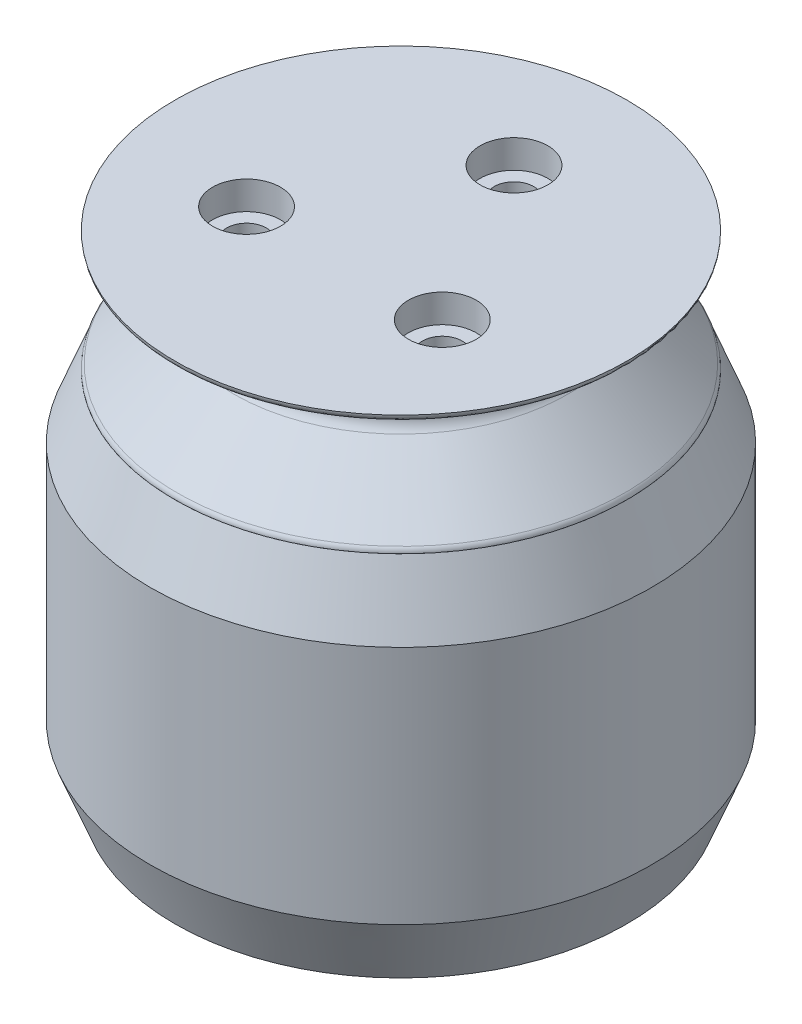
ISO-10303-21;
HEADER;
FILE_DESCRIPTION(('STEP AP214'),'2;1');
FILE_NAME('part.step','',(''),(''),'','','');
FILE_SCHEMA(('AUTOMOTIVE_DESIGN { 1 0 10303 214 1 1 1 1 }'));
ENDSEC;
DATA;
#1=APPLICATION_CONTEXT('core data for automotive mechanical design processes');
#2=APPLICATION_PROTOCOL_DEFINITION('international standard','automotive_design',2000,#1);
#3=PRODUCT_CONTEXT('',#1,'mechanical');
#4=PRODUCT('Part','Part','',(#3));
#5=PRODUCT_RELATED_PRODUCT_CATEGORY('part','',(#4));
#6=PRODUCT_DEFINITION_FORMATION('','',#4);
#7=PRODUCT_DEFINITION_CONTEXT('part definition',#1,'design');
#8=PRODUCT_DEFINITION('design','',#6,#7);
#9=PRODUCT_DEFINITION_SHAPE('','',#8);
#10=(LENGTH_UNIT() NAMED_UNIT(*) SI_UNIT(.MILLI.,.METRE.));
#11=(NAMED_UNIT(*) PLANE_ANGLE_UNIT() SI_UNIT($,.RADIAN.));
#12=(NAMED_UNIT(*) SI_UNIT($,.STERADIAN.) SOLID_ANGLE_UNIT());
#13=UNCERTAINTY_MEASURE_WITH_UNIT(LENGTH_MEASURE(1.E-05),#10,'distance_accuracy_value','');
#14=(GEOMETRIC_REPRESENTATION_CONTEXT(3) GLOBAL_UNCERTAINTY_ASSIGNED_CONTEXT((#13)) GLOBAL_UNIT_ASSIGNED_CONTEXT((#10,
#11,#12)) REPRESENTATION_CONTEXT('',''));
#15=CARTESIAN_POINT('',(0.,0.,0.));
#16=DIRECTION('',(0.,0.,1.));
#17=DIRECTION('',(1.,0.,0.));
#18=AXIS2_PLACEMENT_3D('',#15,#16,#17);
#19=CARTESIAN_POINT('',(-6.92820323027551,24.5,4.));
#20=DIRECTION('',(0.,1.,0.));
#21=DIRECTION('',(0.,0.,1.));
#22=AXIS2_PLACEMENT_3D('',#19,#20,#21);
#23=CYLINDRICAL_SURFACE('',#22,1.4);
#24=CARTESIAN_POINT('',(-6.92820323027551,26.,4.));
#25=DIRECTION('',(0.,1.,0.));
#26=DIRECTION('',(0.,0.,1.));
#27=AXIS2_PLACEMENT_3D('',#24,#25,#26);
#28=CIRCLE('',#27,1.4);
#29=CARTESIAN_POINT('',(-6.92820323027551,26.,5.40000000000001));
#30=VERTEX_POINT('',#29);
#31=EDGE_CURVE('E114',#30,#30,#28,.T.);
#32=ORIENTED_EDGE('',*,*,#31,.F.);
#33=EDGE_LOOP('',(#32));
#34=FACE_BOUND('',#33,.T.);
#35=CARTESIAN_POINT('',(-6.92820323027551,32.5,4.));
#36=DIRECTION('',(0.,1.,0.));
#37=DIRECTION('',(0.,0.,1.));
#38=AXIS2_PLACEMENT_3D('',#35,#36,#37);
#39=CIRCLE('',#38,1.4);
#40=CARTESIAN_POINT('',(-6.92820323027551,32.5,5.40000000000001));
#41=VERTEX_POINT('',#40);
#42=EDGE_CURVE('E131',#41,#41,#39,.T.);
#43=ORIENTED_EDGE('',*,*,#42,.T.);
#44=EDGE_LOOP('',(#43));
#45=FACE_BOUND('',#44,.T.);
#46=ADVANCED_FACE('F76',(#34,#45),#23,.F.);
#47=CARTESIAN_POINT('',(6.92820323027551,24.5,4.));
#48=DIRECTION('',(0.,1.,0.));
#49=DIRECTION('',(0.,0.,1.));
#50=AXIS2_PLACEMENT_3D('',#47,#48,#49);
#51=CYLINDRICAL_SURFACE('',#50,1.4);
#52=CARTESIAN_POINT('',(6.92820323027551,26.,4.));
#53=DIRECTION('',(0.,1.,0.));
#54=DIRECTION('',(0.,0.,1.));
#55=AXIS2_PLACEMENT_3D('',#52,#53,#54);
#56=CIRCLE('',#55,1.4);
#57=CARTESIAN_POINT('',(6.92820323027551,26.,5.4));
#58=VERTEX_POINT('',#57);
#59=EDGE_CURVE('E111',#58,#58,#56,.T.);
#60=ORIENTED_EDGE('',*,*,#59,.F.);
#61=EDGE_LOOP('',(#60));
#62=FACE_BOUND('',#61,.T.);
#63=CARTESIAN_POINT('',(6.92820323027551,32.5,4.));
#64=DIRECTION('',(0.,1.,0.));
#65=DIRECTION('',(0.,0.,1.));
#66=AXIS2_PLACEMENT_3D('',#63,#64,#65);
#67=CIRCLE('',#66,1.4);
#68=CARTESIAN_POINT('',(6.92820323027551,32.5,5.4));
#69=VERTEX_POINT('',#68);
#70=EDGE_CURVE('E134',#69,#69,#67,.T.);
#71=ORIENTED_EDGE('',*,*,#70,.T.);
#72=EDGE_LOOP('',(#71));
#73=FACE_BOUND('',#72,.T.);
#74=ADVANCED_FACE('F145',(#62,#73),#51,.F.);
#75=CARTESIAN_POINT('',(0.,24.5,-8.));
#76=DIRECTION('',(0.,1.,0.));
#77=DIRECTION('',(0.,0.,1.));
#78=AXIS2_PLACEMENT_3D('',#75,#76,#77);
#79=CYLINDRICAL_SURFACE('',#78,1.4);
#80=CARTESIAN_POINT('',(0.,26.,-8.));
#81=DIRECTION('',(0.,1.,0.));
#82=DIRECTION('',(0.,0.,1.));
#83=AXIS2_PLACEMENT_3D('',#80,#81,#82);
#84=CIRCLE('',#83,1.4);
#85=CARTESIAN_POINT('',(0.,26.,-6.6));
#86=VERTEX_POINT('',#85);
#87=EDGE_CURVE('E108',#86,#86,#84,.T.);
#88=ORIENTED_EDGE('',*,*,#87,.F.);
#89=EDGE_LOOP('',(#88));
#90=FACE_BOUND('',#89,.T.);
#91=CARTESIAN_POINT('',(0.,32.5,-8.));
#92=DIRECTION('',(0.,1.,0.));
#93=DIRECTION('',(0.,0.,1.));
#94=AXIS2_PLACEMENT_3D('',#91,#92,#93);
#95=CIRCLE('',#94,1.4);
#96=CARTESIAN_POINT('',(0.,32.5,-6.6));
#97=VERTEX_POINT('',#96);
#98=EDGE_CURVE('E121',#97,#97,#95,.T.);
#99=ORIENTED_EDGE('',*,*,#98,.T.);
#100=EDGE_LOOP('',(#99));
#101=FACE_BOUND('',#100,.T.);
#102=ADVANCED_FACE('F190',(#90,#101),#79,.F.);
#103=CARTESIAN_POINT('',(0.,26.,0.));
#104=DIRECTION('',(0.,-1.,0.));
#105=DIRECTION('',(0.,0.,-1.));
#106=AXIS2_PLACEMENT_3D('',#103,#104,#105);
#107=TOROIDAL_SURFACE('',#106,15.5,0.500000000000001);
#108=CARTESIAN_POINT('',(0.,26.,0.));
#109=DIRECTION('',(0.,-1.,0.));
#110=DIRECTION('',(0.,0.,-1.));
#111=AXIS2_PLACEMENT_3D('',#108,#109,#110);
#112=CIRCLE('',#111,16.);
#113=CARTESIAN_POINT('',(0.,26.,-16.));
#114=VERTEX_POINT('',#113);
#115=EDGE_CURVE('E14',#114,#114,#112,.T.);
#116=ORIENTED_EDGE('',*,*,#115,.F.);
#117=EDGE_LOOP('',(#116));
#118=FACE_BOUND('',#117,.T.);
#119=CARTESIAN_POINT('',(0.,26.3535533905933,0.));
#120=DIRECTION('',(0.,-1.,0.));
#121=DIRECTION('',(0.,0.,-1.));
#122=AXIS2_PLACEMENT_3D('',#119,#120,#121);
#123=CIRCLE('',#122,15.8535533905933);
#124=CARTESIAN_POINT('',(0.,26.3535533905933,-15.8535533905933));
#125=VERTEX_POINT('',#124);
#126=EDGE_CURVE('E105',#125,#125,#123,.T.);
#127=ORIENTED_EDGE('',*,*,#126,.T.);
#128=EDGE_LOOP('',(#127));
#129=FACE_BOUND('',#128,.T.);
#130=ADVANCED_FACE('F78',(#118,#129),#107,.T.);
#131=CARTESIAN_POINT('',(0.,26.,16.));
#132=DIRECTION('',(0.,1.,0.));
#133=DIRECTION('',(0.,0.,1.));
#134=AXIS2_PLACEMENT_3D('',#131,#132,#133);
#135=PLANE('',#134);
#136=ORIENTED_EDGE('',*,*,#59,.T.);
#137=EDGE_LOOP('',(#136));
#138=FACE_BOUND('',#137,.T.);
#139=ORIENTED_EDGE('',*,*,#31,.T.);
#140=EDGE_LOOP('',(#139));
#141=FACE_BOUND('',#140,.T.);
#142=ORIENTED_EDGE('',*,*,#87,.T.);
#143=EDGE_LOOP('',(#142));
#144=FACE_BOUND('',#143,.T.);
#145=CARTESIAN_POINT('',(0.,26.,0.));
#146=DIRECTION('',(0.,-1.,0.));
#147=DIRECTION('',(0.,0.,-1.));
#148=AXIS2_PLACEMENT_3D('',#145,#146,#147);
#149=CIRCLE('',#148,6.);
#150=CARTESIAN_POINT('',(0.,26.,-6.));
#151=VERTEX_POINT('',#150);
#152=EDGE_CURVE('E83',#151,#151,#149,.T.);
#153=ORIENTED_EDGE('',*,*,#152,.F.);
#154=EDGE_LOOP('',(#153));
#155=FACE_BOUND('',#154,.T.);
#156=ORIENTED_EDGE('',*,*,#115,.T.);
#157=EDGE_LOOP('',(#156));
#158=FACE_BOUND('',#157,.T.);
#159=ADVANCED_FACE('F303',(#138,#141,#144,#155,#158),#135,.F.);
#160=CARTESIAN_POINT('',(0.,30.5,0.));
#161=DIRECTION('',(0.,-1.,0.));
#162=DIRECTION('',(0.,0.,-1.));
#163=AXIS2_PLACEMENT_3D('',#160,#161,#162);
#164=CYLINDRICAL_SURFACE('',#163,6.);
#165=CARTESIAN_POINT('',(0.,30.5,0.));
#166=DIRECTION('',(0.,-1.,0.));
#167=DIRECTION('',(0.,0.,-1.));
#168=AXIS2_PLACEMENT_3D('',#165,#166,#167);
#169=CIRCLE('',#168,6.);
#170=CARTESIAN_POINT('',(0.,30.5,-6.));
#171=VERTEX_POINT('',#170);
#172=EDGE_CURVE('E87',#171,#171,#169,.T.);
#173=ORIENTED_EDGE('',*,*,#172,.F.);
#174=EDGE_LOOP('',(#173));
#175=FACE_BOUND('',#174,.T.);
#176=ORIENTED_EDGE('',*,*,#152,.T.);
#177=EDGE_LOOP('',(#176));
#178=FACE_BOUND('',#177,.T.);
#179=ADVANCED_FACE('F308',(#175,#178),#164,.F.);
#180=CARTESIAN_POINT('',(0.,30.5,6.));
#181=DIRECTION('',(0.,1.,0.));
#182=DIRECTION('',(0.,0.,1.));
#183=AXIS2_PLACEMENT_3D('',#180,#181,#182);
#184=PLANE('',#183);
#185=ORIENTED_EDGE('',*,*,#172,.T.);
#186=EDGE_LOOP('',(#185));
#187=FACE_BOUND('',#186,.T.);
#188=ADVANCED_FACE('F165',(#187),#184,.F.);
#189=CARTESIAN_POINT('',(0.,34.5,0.));
#190=DIRECTION('',(0.,-1.,0.));
#191=DIRECTION('',(0.,0.,-1.));
#192=AXIS2_PLACEMENT_3D('',#189,#190,#191);
#193=PLANE('',#192);
#194=CARTESIAN_POINT('',(6.92820323027551,34.5,4.));
#195=DIRECTION('',(0.,1.,0.));
#196=DIRECTION('',(1.,0.,0.));
#197=AXIS2_PLACEMENT_3D('',#194,#195,#196);
#198=CIRCLE('',#197,2.4);
#199=CARTESIAN_POINT('',(9.32820323027551,34.5,4.));
#200=VERTEX_POINT('',#199);
#201=EDGE_CURVE('E137',#200,#200,#198,.T.);
#202=ORIENTED_EDGE('',*,*,#201,.F.);
#203=EDGE_LOOP('',(#202));
#204=FACE_BOUND('',#203,.T.);
#205=CARTESIAN_POINT('',(-6.92820323027551,34.5,4.));
#206=DIRECTION('',(0.,1.,0.));
#207=DIRECTION('',(1.,0.,0.));
#208=AXIS2_PLACEMENT_3D('',#205,#206,#207);
#209=CIRCLE('',#208,2.4);
#210=CARTESIAN_POINT('',(-4.5282032302755,34.5,4.));
#211=VERTEX_POINT('',#210);
#212=EDGE_CURVE('E127',#211,#211,#209,.T.);
#213=ORIENTED_EDGE('',*,*,#212,.F.);
#214=EDGE_LOOP('',(#213));
#215=FACE_BOUND('',#214,.T.);
#216=CARTESIAN_POINT('',(0.,34.5,-8.));
#217=DIRECTION('',(0.,1.,0.));
#218=DIRECTION('',(1.,0.,0.));
#219=AXIS2_PLACEMENT_3D('',#216,#217,#218);
#220=CIRCLE('',#219,2.4);
#221=CARTESIAN_POINT('',(2.4,34.5,-8.));
#222=VERTEX_POINT('',#221);
#223=EDGE_CURVE('E118',#222,#222,#220,.T.);
#224=ORIENTED_EDGE('',*,*,#223,.F.);
#225=EDGE_LOOP('',(#224));
#226=FACE_BOUND('',#225,.T.);
#227=CARTESIAN_POINT('',(0.,34.5,0.));
#228=DIRECTION('',(0.,-1.,0.));
#229=DIRECTION('',(0.,0.,-1.));
#230=AXIS2_PLACEMENT_3D('',#227,#228,#229);
#231=CIRCLE('',#230,16.);
#232=CARTESIAN_POINT('',(0.,34.5,-16.));
#233=VERTEX_POINT('',#232);
#234=EDGE_CURVE('E91',#233,#233,#231,.T.);
#235=ORIENTED_EDGE('',*,*,#234,.F.);
#236=EDGE_LOOP('',(#235));
#237=FACE_BOUND('',#236,.T.);
#238=ADVANCED_FACE('F161',(#204,#215,#226,#237),#193,.F.);
#239=CARTESIAN_POINT('',(0.,34.5,0.));
#240=DIRECTION('',(0.,-1.,0.));
#241=DIRECTION('',(0.,0.,-1.));
#242=AXIS2_PLACEMENT_3D('',#239,#240,#241);
#243=TOROIDAL_SURFACE('',#242,15.5,0.499999999999999);
#244=CARTESIAN_POINT('',(0.,34.0468461064817,0.));
#245=DIRECTION('',(0.,-1.,0.));
#246=DIRECTION('',(0.,0.,-1.));
#247=AXIS2_PLACEMENT_3D('',#244,#245,#246);
#248=CIRCLE('',#247,15.7113091308703);
#249=CARTESIAN_POINT('',(0.,34.0468461064817,-15.7113091308703));
#250=VERTEX_POINT('',#249);
#251=EDGE_CURVE('E96',#250,#250,#248,.T.);
#252=ORIENTED_EDGE('',*,*,#251,.F.);
#253=EDGE_LOOP('',(#252));
#254=FACE_BOUND('',#253,.T.);
#255=ORIENTED_EDGE('',*,*,#234,.T.);
#256=EDGE_LOOP('',(#255));
#257=FACE_BOUND('',#256,.T.);
#258=ADVANCED_FACE('F164',(#254,#257),#243,.T.);
#259=CARTESIAN_POINT('',(0.,34.0468461064817,0.));
#260=DIRECTION('',(0.,1.,0.));
#261=DIRECTION('',(0.,0.,1.));
#262=AXIS2_PLACEMENT_3D('',#259,#260,#261);
#263=CONICAL_SURFACE('',#262,15.7113091308703,1.13446401379632);
#264=CARTESIAN_POINT('',(0.,32.3999521013192,0.));
#265=DIRECTION('',(0.,-1.,0.));
#266=DIRECTION('',(0.,0.,-1.));
#267=AXIS2_PLACEMENT_3D('',#264,#265,#266);
#268=CIRCLE('',#267,12.1795335394536);
#269=CARTESIAN_POINT('',(0.,32.3999521013192,-12.1795335394536));
#270=VERTEX_POINT('',#269);
#271=EDGE_CURVE('E99',#270,#270,#268,.T.);
#272=ORIENTED_EDGE('',*,*,#271,.F.);
#273=EDGE_LOOP('',(#272));
#274=FACE_BOUND('',#273,.T.);
#275=ORIENTED_EDGE('',*,*,#251,.T.);
#276=EDGE_LOOP('',(#275));
#277=FACE_BOUND('',#276,.T.);
#278=ADVANCED_FACE('F174',(#274,#277),#263,.T.);
#279=CARTESIAN_POINT('',(0.,31.2670673675234,0.));
#280=DIRECTION('',(0.,-1.,0.));
#281=DIRECTION('',(0.,0.,-1.));
#282=AXIS2_PLACEMENT_3D('',#279,#280,#281);
#283=TOROIDAL_SURFACE('',#282,12.7078063666295,1.25);
#284=CARTESIAN_POINT('',(0.,30.3831838910402,0.));
#285=DIRECTION('',(0.,-1.,0.));
#286=DIRECTION('',(0.,0.,-1.));
#287=AXIS2_PLACEMENT_3D('',#284,#285,#286);
#288=CIRCLE('',#287,11.8239228901463);
#289=CARTESIAN_POINT('',(0.,30.3831838910402,-11.8239228901463));
#290=VERTEX_POINT('',#289);
#291=EDGE_CURVE('E102',#290,#290,#288,.T.);
#292=ORIENTED_EDGE('',*,*,#291,.F.);
#293=EDGE_LOOP('',(#292));
#294=FACE_BOUND('',#293,.T.);
#295=ORIENTED_EDGE('',*,*,#271,.T.);
#296=EDGE_LOOP('',(#295));
#297=FACE_BOUND('',#296,.T.);
#298=ADVANCED_FACE('F180',(#294,#297),#283,.F.);
#299=CARTESIAN_POINT('',(0.,30.3831838910402,0.));
#300=DIRECTION('',(0.,-1.,0.));
#301=DIRECTION('',(0.,0.,-1.));
#302=AXIS2_PLACEMENT_3D('',#299,#300,#301);
#303=CONICAL_SURFACE('',#302,11.8239228901463,0.785398163397454);
#304=ORIENTED_EDGE('',*,*,#126,.F.);
#305=EDGE_LOOP('',(#304));
#306=FACE_BOUND('',#305,.T.);
#307=ORIENTED_EDGE('',*,*,#291,.T.);
#308=EDGE_LOOP('',(#307));
#309=FACE_BOUND('',#308,.T.);
#310=ADVANCED_FACE('F200',(#306,#309),#303,.T.);
#311=CARTESIAN_POINT('',(0.,32.5,-8.));
#312=DIRECTION('',(0.,1.,0.));
#313=DIRECTION('',(0.,0.,1.));
#314=AXIS2_PLACEMENT_3D('',#311,#312,#313);
#315=CYLINDRICAL_SURFACE('',#314,2.4);
#316=CARTESIAN_POINT('',(0.,32.5,-8.));
#317=DIRECTION('',(0.,1.,0.));
#318=DIRECTION('',(1.,0.,0.));
#319=AXIS2_PLACEMENT_3D('',#316,#317,#318);
#320=CIRCLE('',#319,2.4);
#321=CARTESIAN_POINT('',(2.4,32.5,-8.));
#322=VERTEX_POINT('',#321);
#323=EDGE_CURVE('E117',#322,#322,#320,.T.);
#324=ORIENTED_EDGE('',*,*,#323,.F.);
#325=EDGE_LOOP('',(#324));
#326=FACE_BOUND('',#325,.T.);
#327=ORIENTED_EDGE('',*,*,#223,.T.);
#328=EDGE_LOOP('',(#327));
#329=FACE_BOUND('',#328,.T.);
#330=ADVANCED_FACE('F203',(#326,#329),#315,.F.);
#331=CARTESIAN_POINT('',(0.,32.5,-8.));
#332=DIRECTION('',(0.,1.,0.));
#333=DIRECTION('',(0.,0.,1.));
#334=AXIS2_PLACEMENT_3D('',#331,#332,#333);
#335=PLANE('',#334);
#336=ORIENTED_EDGE('',*,*,#98,.F.);
#337=EDGE_LOOP('',(#336));
#338=FACE_BOUND('',#337,.T.);
#339=ORIENTED_EDGE('',*,*,#323,.T.);
#340=EDGE_LOOP('',(#339));
#341=FACE_BOUND('',#340,.T.);
#342=ADVANCED_FACE('F157',(#338,#341),#335,.T.);
#343=CARTESIAN_POINT('',(6.92820323027551,32.5,4.));
#344=DIRECTION('',(0.,1.,0.));
#345=DIRECTION('',(0.,0.,1.));
#346=AXIS2_PLACEMENT_3D('',#343,#344,#345);
#347=CYLINDRICAL_SURFACE('',#346,2.4);
#348=CARTESIAN_POINT('',(6.92820323027551,32.5,4.));
#349=DIRECTION('',(0.,1.,0.));
#350=DIRECTION('',(1.,0.,0.));
#351=AXIS2_PLACEMENT_3D('',#348,#349,#350);
#352=CIRCLE('',#351,2.4);
#353=CARTESIAN_POINT('',(9.32820323027551,32.5,4.));
#354=VERTEX_POINT('',#353);
#355=EDGE_CURVE('E126',#354,#354,#352,.T.);
#356=ORIENTED_EDGE('',*,*,#355,.F.);
#357=EDGE_LOOP('',(#356));
#358=FACE_BOUND('',#357,.T.);
#359=ORIENTED_EDGE('',*,*,#201,.T.);
#360=EDGE_LOOP('',(#359));
#361=FACE_BOUND('',#360,.T.);
#362=ADVANCED_FACE('F151',(#358,#361),#347,.F.);
#363=CARTESIAN_POINT('',(6.92820323027551,32.5,4.));
#364=DIRECTION('',(0.,1.,0.));
#365=DIRECTION('',(0.,0.,1.));
#366=AXIS2_PLACEMENT_3D('',#363,#364,#365);
#367=PLANE('',#366);
#368=ORIENTED_EDGE('',*,*,#70,.F.);
#369=EDGE_LOOP('',(#368));
#370=FACE_BOUND('',#369,.T.);
#371=ORIENTED_EDGE('',*,*,#355,.T.);
#372=EDGE_LOOP('',(#371));
#373=FACE_BOUND('',#372,.T.);
#374=ADVANCED_FACE('F147',(#370,#373),#367,.T.);
#375=CARTESIAN_POINT('',(-6.92820323027551,32.5,4.));
#376=DIRECTION('',(0.,1.,0.));
#377=DIRECTION('',(0.,0.,1.));
#378=AXIS2_PLACEMENT_3D('',#375,#376,#377);
#379=CYLINDRICAL_SURFACE('',#378,2.4);
#380=CARTESIAN_POINT('',(-6.92820323027551,32.5,4.));
#381=DIRECTION('',(0.,1.,0.));
#382=DIRECTION('',(1.,0.,0.));
#383=AXIS2_PLACEMENT_3D('',#380,#381,#382);
#384=CIRCLE('',#383,2.4);
#385=CARTESIAN_POINT('',(-4.5282032302755,32.5,4.));
#386=VERTEX_POINT('',#385);
#387=EDGE_CURVE('E130',#386,#386,#384,.T.);
#388=ORIENTED_EDGE('',*,*,#387,.F.);
#389=EDGE_LOOP('',(#388));
#390=FACE_BOUND('',#389,.T.);
#391=ORIENTED_EDGE('',*,*,#212,.T.);
#392=EDGE_LOOP('',(#391));
#393=FACE_BOUND('',#392,.T.);
#394=ADVANCED_FACE('F150',(#390,#393),#379,.F.);
#395=CARTESIAN_POINT('',(-6.92820323027551,32.5,4.));
#396=DIRECTION('',(0.,1.,0.));
#397=DIRECTION('',(0.,0.,1.));
#398=AXIS2_PLACEMENT_3D('',#395,#396,#397);
#399=PLANE('',#398);
#400=ORIENTED_EDGE('',*,*,#42,.F.);
#401=EDGE_LOOP('',(#400));
#402=FACE_BOUND('',#401,.T.);
#403=ORIENTED_EDGE('',*,*,#387,.T.);
#404=EDGE_LOOP('',(#403));
#405=FACE_BOUND('',#404,.T.);
#406=ADVANCED_FACE('F241',(#402,#405),#399,.T.);
#407=CLOSED_SHELL('',(#46,#74,#102,#130,#159,#179,#188,#238,#258,#278,#298,#310,#330,#342,#362,
#374,#394,#406));
#408=MANIFOLD_SOLID_BREP('B2',#407);
#409=CARTESIAN_POINT('',(0.,0.,0.));
#410=DIRECTION('',(0.,1.,0.));
#411=DIRECTION('',(0.,0.,1.));
#412=AXIS2_PLACEMENT_3D('',#409,#410,#411);
#413=PLANE('',#412);
#414=CARTESIAN_POINT('',(0.,0.,0.));
#415=DIRECTION('',(0.,1.,0.));
#416=DIRECTION('',(0.,0.,1.));
#417=AXIS2_PLACEMENT_3D('',#414,#415,#416);
#418=CIRCLE('',#417,16.);
#419=CARTESIAN_POINT('',(0.,0.,16.));
#420=VERTEX_POINT('',#419);
#421=EDGE_CURVE('E75',#420,#420,#418,.T.);
#422=ORIENTED_EDGE('',*,*,#421,.F.);
#423=EDGE_LOOP('',(#422));
#424=FACE_BOUND('',#423,.T.);
#425=ADVANCED_FACE('F383',(#424),#413,.F.);
#426=CARTESIAN_POINT('',(0.,0.,0.));
#427=DIRECTION('',(0.,1.,0.));
#428=DIRECTION('',(0.,0.,1.));
#429=AXIS2_PLACEMENT_3D('',#426,#427,#428);
#430=CONICAL_SURFACE('',#429,16.,0.370891288812663);
#431=CARTESIAN_POINT('',(0.,4.5,0.));
#432=DIRECTION('',(0.,1.,0.));
#433=DIRECTION('',(0.,0.,1.));
#434=AXIS2_PLACEMENT_3D('',#431,#432,#433);
#435=CIRCLE('',#434,17.75);
#436=CARTESIAN_POINT('',(0.,4.5,17.75));
#437=VERTEX_POINT('',#436);
#438=EDGE_CURVE('E389',#437,#437,#435,.T.);
#439=ORIENTED_EDGE('',*,*,#438,.F.);
#440=EDGE_LOOP('',(#439));
#441=FACE_BOUND('',#440,.T.);
#442=ORIENTED_EDGE('',*,*,#421,.T.);
#443=EDGE_LOOP('',(#442));
#444=FACE_BOUND('',#443,.T.);
#445=ADVANCED_FACE('F431',(#441,#444),#430,.T.);
#446=CARTESIAN_POINT('',(0.,30.,0.));
#447=DIRECTION('',(0.,1.,0.));
#448=DIRECTION('',(0.,0.,1.));
#449=AXIS2_PLACEMENT_3D('',#446,#447,#448);
#450=CYLINDRICAL_SURFACE('',#449,17.75);
#451=CARTESIAN_POINT('',(0.,21.5,0.));
#452=DIRECTION('',(0.,1.,0.));
#453=DIRECTION('',(0.,0.,1.));
#454=AXIS2_PLACEMENT_3D('',#451,#452,#453);
#455=CIRCLE('',#454,17.75);
#456=CARTESIAN_POINT('',(0.,21.5,17.75));
#457=VERTEX_POINT('',#456);
#458=EDGE_CURVE('E393',#457,#457,#455,.T.);
#459=ORIENTED_EDGE('',*,*,#458,.F.);
#460=EDGE_LOOP('',(#459));
#461=FACE_BOUND('',#460,.T.);
#462=ORIENTED_EDGE('',*,*,#438,.T.);
#463=EDGE_LOOP('',(#462));
#464=FACE_BOUND('',#463,.T.);
#465=ADVANCED_FACE('F426',(#461,#464),#450,.T.);
#466=CARTESIAN_POINT('',(0.,21.5,0.));
#467=DIRECTION('',(0.,-1.,0.));
#468=DIRECTION('',(0.,0.,-1.));
#469=AXIS2_PLACEMENT_3D('',#466,#467,#468);
#470=CONICAL_SURFACE('',#469,17.75,0.370891288812663);
#471=CARTESIAN_POINT('',(0.,26.,0.));
#472=DIRECTION('',(0.,1.,0.));
#473=DIRECTION('',(0.,0.,1.));
#474=AXIS2_PLACEMENT_3D('',#471,#472,#473);
#475=CIRCLE('',#474,16.);
#476=CARTESIAN_POINT('',(0.,26.,16.));
#477=VERTEX_POINT('',#476);
#478=EDGE_CURVE('E397',#477,#477,#475,.T.);
#479=ORIENTED_EDGE('',*,*,#478,.F.);
#480=EDGE_LOOP('',(#479));
#481=FACE_BOUND('',#480,.T.);
#482=ORIENTED_EDGE('',*,*,#458,.T.);
#483=EDGE_LOOP('',(#482));
#484=FACE_BOUND('',#483,.T.);
#485=ADVANCED_FACE('F420',(#481,#484),#470,.T.);
#486=CARTESIAN_POINT('',(0.,26.,-16.));
#487=DIRECTION('',(0.,-1.,0.));
#488=DIRECTION('',(0.,0.,-1.));
#489=AXIS2_PLACEMENT_3D('',#486,#487,#488);
#490=PLANE('',#489);
#491=CARTESIAN_POINT('',(0.,26.,0.));
#492=DIRECTION('',(0.,1.,0.));
#493=DIRECTION('',(0.,0.,1.));
#494=AXIS2_PLACEMENT_3D('',#491,#492,#493);
#495=CIRCLE('',#494,5.5);
#496=CARTESIAN_POINT('',(0.,26.,5.5));
#497=VERTEX_POINT('',#496);
#498=EDGE_CURVE('E402',#497,#497,#495,.T.);
#499=ORIENTED_EDGE('',*,*,#498,.F.);
#500=EDGE_LOOP('',(#499));
#501=FACE_BOUND('',#500,.T.);
#502=ORIENTED_EDGE('',*,*,#478,.T.);
#503=EDGE_LOOP('',(#502));
#504=FACE_BOUND('',#503,.T.);
#505=ADVANCED_FACE('F414',(#501,#504),#490,.F.);
#506=CARTESIAN_POINT('',(0.,30.,0.));
#507=DIRECTION('',(0.,1.,0.));
#508=DIRECTION('',(0.,0.,1.));
#509=AXIS2_PLACEMENT_3D('',#506,#507,#508);
#510=CYLINDRICAL_SURFACE('',#509,5.5);
#511=CARTESIAN_POINT('',(0.,30.,0.));
#512=DIRECTION('',(0.,1.,0.));
#513=DIRECTION('',(0.,0.,1.));
#514=AXIS2_PLACEMENT_3D('',#511,#512,#513);
#515=CIRCLE('',#514,5.5);
#516=CARTESIAN_POINT('',(0.,30.,5.5));
#517=VERTEX_POINT('',#516);
#518=EDGE_CURVE('E405',#517,#517,#515,.T.);
#519=ORIENTED_EDGE('',*,*,#518,.F.);
#520=EDGE_LOOP('',(#519));
#521=FACE_BOUND('',#520,.T.);
#522=ORIENTED_EDGE('',*,*,#498,.T.);
#523=EDGE_LOOP('',(#522));
#524=FACE_BOUND('',#523,.T.);
#525=ADVANCED_FACE('F411',(#521,#524),#510,.T.);
#526=CARTESIAN_POINT('',(0.,30.,-5.5));
#527=DIRECTION('',(0.,-1.,0.));
#528=DIRECTION('',(0.,0.,-1.));
#529=AXIS2_PLACEMENT_3D('',#526,#527,#528);
#530=PLANE('',#529);
#531=ORIENTED_EDGE('',*,*,#518,.T.);
#532=EDGE_LOOP('',(#531));
#533=FACE_BOUND('',#532,.T.);
#534=ADVANCED_FACE('F409',(#533),#530,.F.);
#535=CLOSED_SHELL('',(#425,#445,#465,#485,#505,#525,#534));
#536=MANIFOLD_SOLID_BREP('B9',#535);
#537=ADVANCED_BREP_SHAPE_REPRESENTATION('',(#18,#408,#536),#14);
#538=SHAPE_DEFINITION_REPRESENTATION(#9,#537);
ENDSEC;
END-ISO-10303-21;
